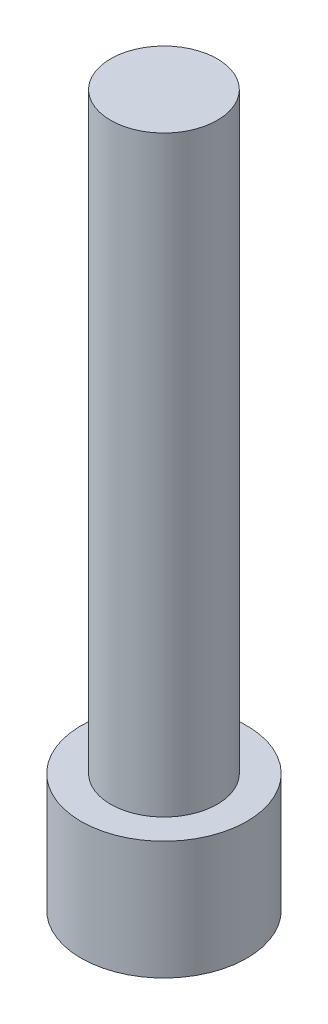
ISO-10303-21;
HEADER;
FILE_DESCRIPTION(('STEP AP214'),'2;1');
FILE_NAME('part.step','',(''),(''),'','','');
FILE_SCHEMA(('AUTOMOTIVE_DESIGN { 1 0 10303 214 1 1 1 1 }'));
ENDSEC;
DATA;
#1=APPLICATION_CONTEXT('core data for automotive mechanical design processes');
#2=APPLICATION_PROTOCOL_DEFINITION('international standard','automotive_design',2000,#1);
#3=PRODUCT_CONTEXT('',#1,'mechanical');
#4=PRODUCT('Part','Part','',(#3));
#5=PRODUCT_RELATED_PRODUCT_CATEGORY('part','',(#4));
#6=PRODUCT_DEFINITION_FORMATION('','',#4);
#7=PRODUCT_DEFINITION_CONTEXT('part definition',#1,'design');
#8=PRODUCT_DEFINITION('design','',#6,#7);
#9=PRODUCT_DEFINITION_SHAPE('','',#8);
#10=(LENGTH_UNIT() NAMED_UNIT(*) SI_UNIT(.MILLI.,.METRE.));
#11=(NAMED_UNIT(*) PLANE_ANGLE_UNIT() SI_UNIT($,.RADIAN.));
#12=(NAMED_UNIT(*) SI_UNIT($,.STERADIAN.) SOLID_ANGLE_UNIT());
#13=UNCERTAINTY_MEASURE_WITH_UNIT(LENGTH_MEASURE(1.E-05),#10,'distance_accuracy_value','');
#14=(GEOMETRIC_REPRESENTATION_CONTEXT(3) GLOBAL_UNCERTAINTY_ASSIGNED_CONTEXT((#13)) GLOBAL_UNIT_ASSIGNED_CONTEXT((#10,
#11,#12)) REPRESENTATION_CONTEXT('',''));
#15=CARTESIAN_POINT('',(0.,0.,0.));
#16=DIRECTION('',(0.,0.,1.));
#17=DIRECTION('',(1.,0.,0.));
#18=AXIS2_PLACEMENT_3D('',#15,#16,#17);
#19=CARTESIAN_POINT('',(0.,10.,0.));
#20=DIRECTION('',(0.,-1.,0.));
#21=DIRECTION('',(0.,0.,-1.));
#22=AXIS2_PLACEMENT_3D('',#19,#20,#21);
#23=CYLINDRICAL_SURFACE('',#22,7.);
#24=CARTESIAN_POINT('',(0.,10.,0.));
#25=DIRECTION('',(0.,1.,0.));
#26=DIRECTION('',(0.,0.,1.));
#27=AXIS2_PLACEMENT_3D('',#24,#25,#26);
#28=CIRCLE('',#27,7.);
#29=CARTESIAN_POINT('',(0.,10.,7.));
#30=VERTEX_POINT('',#29);
#31=EDGE_CURVE('E43',#30,#30,#28,.T.);
#32=ORIENTED_EDGE('',*,*,#31,.F.);
#33=EDGE_LOOP('',(#32));
#34=FACE_BOUND('',#33,.T.);
#35=CARTESIAN_POINT('',(0.,0.,0.));
#36=DIRECTION('',(0.,1.,0.));
#37=DIRECTION('',(0.,0.,1.));
#38=AXIS2_PLACEMENT_3D('',#35,#36,#37);
#39=CIRCLE('',#38,7.);
#40=CARTESIAN_POINT('',(0.,0.,7.));
#41=VERTEX_POINT('',#40);
#42=EDGE_CURVE('E38',#41,#41,#39,.T.);
#43=ORIENTED_EDGE('',*,*,#42,.T.);
#44=EDGE_LOOP('',(#43));
#45=FACE_BOUND('',#44,.T.);
#46=ADVANCED_FACE('F35',(#34,#45),#23,.T.);
#47=CARTESIAN_POINT('',(0.,10.,0.));
#48=DIRECTION('',(0.,1.,0.));
#49=DIRECTION('',(0.,0.,1.));
#50=AXIS2_PLACEMENT_3D('',#47,#48,#49);
#51=PLANE('',#50);
#52=CARTESIAN_POINT('',(0.,10.,0.));
#53=DIRECTION('',(0.,1.,0.));
#54=DIRECTION('',(0.,0.,1.));
#55=AXIS2_PLACEMENT_3D('',#52,#53,#54);
#56=CIRCLE('',#55,4.5);
#57=CARTESIAN_POINT('',(0.,10.,4.5));
#58=VERTEX_POINT('',#57);
#59=EDGE_CURVE('E11',#58,#58,#56,.T.);
#60=ORIENTED_EDGE('',*,*,#59,.F.);
#61=EDGE_LOOP('',(#60));
#62=FACE_BOUND('',#61,.T.);
#63=ORIENTED_EDGE('',*,*,#31,.T.);
#64=EDGE_LOOP('',(#63));
#65=FACE_BOUND('',#64,.T.);
#66=ADVANCED_FACE('F155',(#62,#65),#51,.T.);
#67=CARTESIAN_POINT('',(0.,0.,0.));
#68=DIRECTION('',(0.,1.,0.));
#69=DIRECTION('',(0.,0.,1.));
#70=AXIS2_PLACEMENT_3D('',#67,#68,#69);
#71=PLANE('',#70);
#72=DIRECTION('',(0.866025403784438,0.,0.5));
#73=VECTOR('',#72,1.);
#74=CARTESIAN_POINT('',(0.,0.,-3.46410161513776));
#75=LINE('',#74,#73);
#76=CARTESIAN_POINT('',(0.,0.,-3.46410161513776));
#77=VERTEX_POINT('',#76);
#78=CARTESIAN_POINT('',(3.,0.,-1.73205080756888));
#79=VERTEX_POINT('',#78);
#80=EDGE_CURVE('E125',#77,#79,#75,.T.);
#81=ORIENTED_EDGE('',*,*,#80,.F.);
#82=DIRECTION('',(0.866025403784439,0.,-0.5));
#83=VECTOR('',#82,1.);
#84=CARTESIAN_POINT('',(-3.,0.,-1.73205080756888));
#85=LINE('',#84,#83);
#86=CARTESIAN_POINT('',(-3.,0.,-1.73205080756888));
#87=VERTEX_POINT('',#86);
#88=EDGE_CURVE('E51',#87,#77,#85,.T.);
#89=ORIENTED_EDGE('',*,*,#88,.F.);
#90=DIRECTION('',(0.,0.,-1.));
#91=VECTOR('',#90,1.);
#92=CARTESIAN_POINT('',(-3.,0.,1.73205080756888));
#93=LINE('',#92,#91);
#94=CARTESIAN_POINT('',(-3.,0.,1.73205080756888));
#95=VERTEX_POINT('',#94);
#96=EDGE_CURVE('E134',#95,#87,#93,.T.);
#97=ORIENTED_EDGE('',*,*,#96,.F.);
#98=DIRECTION('',(-0.866025403784439,0.,-0.5));
#99=VECTOR('',#98,1.);
#100=CARTESIAN_POINT('',(0.,0.,3.46410161513776));
#101=LINE('',#100,#99);
#102=CARTESIAN_POINT('',(0.,0.,3.46410161513776));
#103=VERTEX_POINT('',#102);
#104=EDGE_CURVE('E132',#103,#95,#101,.T.);
#105=ORIENTED_EDGE('',*,*,#104,.F.);
#106=DIRECTION('',(-0.866025403784439,0.,0.5));
#107=VECTOR('',#106,1.);
#108=CARTESIAN_POINT('',(3.,0.,1.73205080756888));
#109=LINE('',#108,#107);
#110=CARTESIAN_POINT('',(3.,0.,1.73205080756888));
#111=VERTEX_POINT('',#110);
#112=EDGE_CURVE('E99',#111,#103,#109,.T.);
#113=ORIENTED_EDGE('',*,*,#112,.F.);
#114=DIRECTION('',(0.,0.,1.));
#115=VECTOR('',#114,1.);
#116=CARTESIAN_POINT('',(3.,0.,-1.73205080756888));
#117=LINE('',#116,#115);
#118=EDGE_CURVE('E128',#79,#111,#117,.T.);
#119=ORIENTED_EDGE('',*,*,#118,.F.);
#120=EDGE_LOOP('',(#81,#89,#97,#105,#113,#119));
#121=FACE_BOUND('',#120,.T.);
#122=ORIENTED_EDGE('',*,*,#42,.F.);
#123=EDGE_LOOP('',(#122));
#124=FACE_BOUND('',#123,.T.);
#125=ADVANCED_FACE('F152',(#121,#124),#71,.F.);
#126=CARTESIAN_POINT('',(0.,60.,0.));
#127=DIRECTION('',(0.,-1.,0.));
#128=DIRECTION('',(0.,0.,-1.));
#129=AXIS2_PLACEMENT_3D('',#126,#127,#128);
#130=CYLINDRICAL_SURFACE('',#129,4.5);
#131=CARTESIAN_POINT('',(0.,60.,0.));
#132=DIRECTION('',(0.,1.,0.));
#133=DIRECTION('',(0.,0.,1.));
#134=AXIS2_PLACEMENT_3D('',#131,#132,#133);
#135=CIRCLE('',#134,4.5);
#136=CARTESIAN_POINT('',(0.,60.,4.5));
#137=VERTEX_POINT('',#136);
#138=EDGE_CURVE('E138',#137,#137,#135,.T.);
#139=ORIENTED_EDGE('',*,*,#138,.F.);
#140=EDGE_LOOP('',(#139));
#141=FACE_BOUND('',#140,.T.);
#142=ORIENTED_EDGE('',*,*,#59,.T.);
#143=EDGE_LOOP('',(#142));
#144=FACE_BOUND('',#143,.T.);
#145=ADVANCED_FACE('F154',(#141,#144),#130,.T.);
#146=CARTESIAN_POINT('',(0.,60.,0.));
#147=DIRECTION('',(0.,1.,0.));
#148=DIRECTION('',(0.,0.,1.));
#149=AXIS2_PLACEMENT_3D('',#146,#147,#148);
#150=PLANE('',#149);
#151=ORIENTED_EDGE('',*,*,#138,.T.);
#152=EDGE_LOOP('',(#151));
#153=FACE_BOUND('',#152,.T.);
#154=ADVANCED_FACE('F161',(#153),#150,.T.);
#155=CARTESIAN_POINT('',(-3.,5.,-1.73205080756888));
#156=DIRECTION('',(-0.5,0.,-0.866025403784439));
#157=DIRECTION('',(-0.866025403784439,0.,0.5));
#158=AXIS2_PLACEMENT_3D('',#155,#156,#157);
#159=PLANE('',#158);
#160=ORIENTED_EDGE('',*,*,#88,.T.);
#161=DIRECTION('',(0.,-1.,0.));
#162=VECTOR('',#161,1.);
#163=CARTESIAN_POINT('',(0.,5.,-3.46410161513776));
#164=LINE('',#163,#162);
#165=CARTESIAN_POINT('',(0.,5.,-3.46410161513776));
#166=VERTEX_POINT('',#165);
#167=EDGE_CURVE('E81',#166,#77,#164,.T.);
#168=ORIENTED_EDGE('',*,*,#167,.F.);
#169=DIRECTION('',(0.866025403784439,0.,-0.5));
#170=VECTOR('',#169,1.);
#171=CARTESIAN_POINT('',(-3.,5.,-1.73205080756888));
#172=LINE('',#171,#170);
#173=CARTESIAN_POINT('',(-3.,5.,-1.73205080756888));
#174=VERTEX_POINT('',#173);
#175=EDGE_CURVE('E136',#174,#166,#172,.T.);
#176=ORIENTED_EDGE('',*,*,#175,.F.);
#177=DIRECTION('',(0.,-1.,0.));
#178=VECTOR('',#177,1.);
#179=CARTESIAN_POINT('',(-3.,5.,-1.73205080756888));
#180=LINE('',#179,#178);
#181=EDGE_CURVE('E59',#174,#87,#180,.T.);
#182=ORIENTED_EDGE('',*,*,#181,.T.);
#183=EDGE_LOOP('',(#160,#168,#176,#182));
#184=FACE_BOUND('',#183,.T.);
#185=ADVANCED_FACE('F190',(#184),#159,.F.);
#186=CARTESIAN_POINT('',(-3.,5.,1.73205080756888));
#187=DIRECTION('',(-1.,0.,0.));
#188=DIRECTION('',(0.,0.,1.));
#189=AXIS2_PLACEMENT_3D('',#186,#187,#188);
#190=PLANE('',#189);
#191=ORIENTED_EDGE('',*,*,#96,.T.);
#192=ORIENTED_EDGE('',*,*,#181,.F.);
#193=DIRECTION('',(0.,0.,-1.));
#194=VECTOR('',#193,1.);
#195=CARTESIAN_POINT('',(-3.,5.,1.73205080756888));
#196=LINE('',#195,#194);
#197=CARTESIAN_POINT('',(-3.,5.,1.73205080756888));
#198=VERTEX_POINT('',#197);
#199=EDGE_CURVE('E111',#198,#174,#196,.T.);
#200=ORIENTED_EDGE('',*,*,#199,.F.);
#201=DIRECTION('',(0.,-1.,0.));
#202=VECTOR('',#201,1.);
#203=CARTESIAN_POINT('',(-3.,5.,1.73205080756888));
#204=LINE('',#203,#202);
#205=EDGE_CURVE('E103',#198,#95,#204,.T.);
#206=ORIENTED_EDGE('',*,*,#205,.T.);
#207=EDGE_LOOP('',(#191,#192,#200,#206));
#208=FACE_BOUND('',#207,.T.);
#209=ADVANCED_FACE('F204',(#208),#190,.F.);
#210=CARTESIAN_POINT('',(0.,5.,3.46410161513776));
#211=DIRECTION('',(-0.5,0.,0.866025403784439));
#212=DIRECTION('',(0.866025403784439,0.,0.5));
#213=AXIS2_PLACEMENT_3D('',#210,#211,#212);
#214=PLANE('',#213);
#215=ORIENTED_EDGE('',*,*,#104,.T.);
#216=ORIENTED_EDGE('',*,*,#205,.F.);
#217=DIRECTION('',(-0.866025403784439,0.,-0.5));
#218=VECTOR('',#217,1.);
#219=CARTESIAN_POINT('',(0.,5.,3.46410161513776));
#220=LINE('',#219,#218);
#221=CARTESIAN_POINT('',(0.,5.,3.46410161513776));
#222=VERTEX_POINT('',#221);
#223=EDGE_CURVE('E107',#222,#198,#220,.T.);
#224=ORIENTED_EDGE('',*,*,#223,.F.);
#225=DIRECTION('',(0.,-1.,0.));
#226=VECTOR('',#225,1.);
#227=CARTESIAN_POINT('',(0.,5.,3.46410161513776));
#228=LINE('',#227,#226);
#229=EDGE_CURVE('E92',#222,#103,#228,.T.);
#230=ORIENTED_EDGE('',*,*,#229,.T.);
#231=EDGE_LOOP('',(#215,#216,#224,#230));
#232=FACE_BOUND('',#231,.T.);
#233=ADVANCED_FACE('F108',(#232),#214,.F.);
#234=CARTESIAN_POINT('',(3.,5.,1.73205080756888));
#235=DIRECTION('',(0.5,0.,0.866025403784439));
#236=DIRECTION('',(0.866025403784439,0.,-0.5));
#237=AXIS2_PLACEMENT_3D('',#234,#235,#236);
#238=PLANE('',#237);
#239=ORIENTED_EDGE('',*,*,#112,.T.);
#240=ORIENTED_EDGE('',*,*,#229,.F.);
#241=DIRECTION('',(-0.866025403784439,0.,0.5));
#242=VECTOR('',#241,1.);
#243=CARTESIAN_POINT('',(3.,5.,1.73205080756888));
#244=LINE('',#243,#242);
#245=CARTESIAN_POINT('',(3.,5.,1.73205080756888));
#246=VERTEX_POINT('',#245);
#247=EDGE_CURVE('E96',#246,#222,#244,.T.);
#248=ORIENTED_EDGE('',*,*,#247,.F.);
#249=DIRECTION('',(0.,-1.,0.));
#250=VECTOR('',#249,1.);
#251=CARTESIAN_POINT('',(3.,5.,1.73205080756888));
#252=LINE('',#251,#250);
#253=EDGE_CURVE('E104',#246,#111,#252,.T.);
#254=ORIENTED_EDGE('',*,*,#253,.T.);
#255=EDGE_LOOP('',(#239,#240,#248,#254));
#256=FACE_BOUND('',#255,.T.);
#257=ADVANCED_FACE('F94',(#256),#238,.F.);
#258=CARTESIAN_POINT('',(3.,5.,-1.73205080756888));
#259=DIRECTION('',(1.,0.,0.));
#260=DIRECTION('',(0.,0.,-1.));
#261=AXIS2_PLACEMENT_3D('',#258,#259,#260);
#262=PLANE('',#261);
#263=ORIENTED_EDGE('',*,*,#118,.T.);
#264=ORIENTED_EDGE('',*,*,#253,.F.);
#265=DIRECTION('',(0.,0.,1.));
#266=VECTOR('',#265,1.);
#267=CARTESIAN_POINT('',(3.,5.,-1.73205080756888));
#268=LINE('',#267,#266);
#269=CARTESIAN_POINT('',(3.,5.,-1.73205080756888));
#270=VERTEX_POINT('',#269);
#271=EDGE_CURVE('E117',#270,#246,#268,.T.);
#272=ORIENTED_EDGE('',*,*,#271,.F.);
#273=DIRECTION('',(0.,-1.,0.));
#274=VECTOR('',#273,1.);
#275=CARTESIAN_POINT('',(3.,5.,-1.73205080756888));
#276=LINE('',#275,#274);
#277=EDGE_CURVE('E141',#270,#79,#276,.T.);
#278=ORIENTED_EDGE('',*,*,#277,.T.);
#279=EDGE_LOOP('',(#263,#264,#272,#278));
#280=FACE_BOUND('',#279,.T.);
#281=ADVANCED_FACE('F229',(#280),#262,.F.);
#282=CARTESIAN_POINT('',(0.,5.,-3.46410161513776));
#283=DIRECTION('',(0.5,0.,-0.866025403784438));
#284=DIRECTION('',(-0.866025403784438,0.,-0.5));
#285=AXIS2_PLACEMENT_3D('',#282,#283,#284);
#286=PLANE('',#285);
#287=ORIENTED_EDGE('',*,*,#80,.T.);
#288=ORIENTED_EDGE('',*,*,#277,.F.);
#289=DIRECTION('',(0.866025403784438,0.,0.5));
#290=VECTOR('',#289,1.);
#291=CARTESIAN_POINT('',(0.,5.,-3.46410161513776));
#292=LINE('',#291,#290);
#293=EDGE_CURVE('E119',#166,#270,#292,.T.);
#294=ORIENTED_EDGE('',*,*,#293,.F.);
#295=ORIENTED_EDGE('',*,*,#167,.T.);
#296=EDGE_LOOP('',(#287,#288,#294,#295));
#297=FACE_BOUND('',#296,.T.);
#298=ADVANCED_FACE('F238',(#297),#286,.F.);
#299=CARTESIAN_POINT('',(0.,5.,0.));
#300=DIRECTION('',(0.,-1.,0.));
#301=DIRECTION('',(0.,0.,-1.));
#302=AXIS2_PLACEMENT_3D('',#299,#300,#301);
#303=PLANE('',#302);
#304=ORIENTED_EDGE('',*,*,#175,.T.);
#305=ORIENTED_EDGE('',*,*,#293,.T.);
#306=ORIENTED_EDGE('',*,*,#271,.T.);
#307=ORIENTED_EDGE('',*,*,#247,.T.);
#308=ORIENTED_EDGE('',*,*,#223,.T.);
#309=ORIENTED_EDGE('',*,*,#199,.T.);
#310=EDGE_LOOP('',(#304,#305,#306,#307,#308,#309));
#311=FACE_BOUND('',#310,.T.);
#312=ADVANCED_FACE('F114',(#311),#303,.T.);
#313=CLOSED_SHELL('',(#46,#66,#125,#145,#154,#185,#209,#233,#257,#281,#298,#312));
#314=MANIFOLD_SOLID_BREP('B2',#313);
#315=ADVANCED_BREP_SHAPE_REPRESENTATION('',(#18,#314),#14);
#316=SHAPE_DEFINITION_REPRESENTATION(#9,#315);
ENDSEC;
END-ISO-10303-21;
